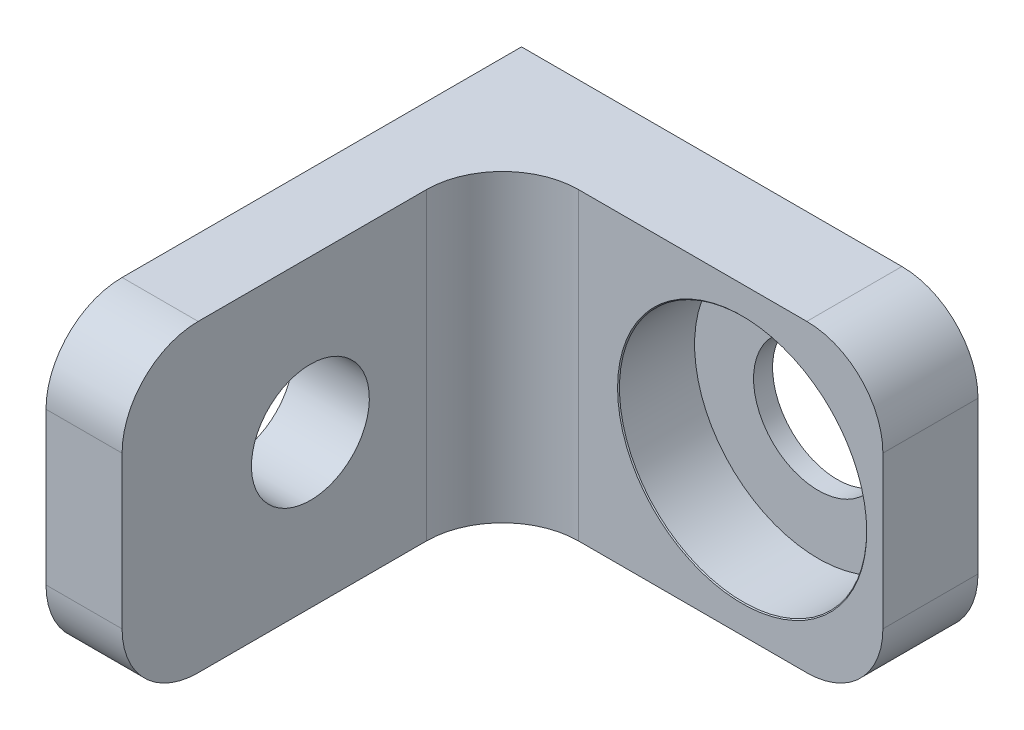
ISO-10303-21;
HEADER;
FILE_DESCRIPTION(('STEP AP214'),'2;1');
FILE_NAME('part.step','',(''),(''),'','','');
FILE_SCHEMA(('AUTOMOTIVE_DESIGN { 1 0 10303 214 1 1 1 1 }'));
ENDSEC;
DATA;
#1=APPLICATION_CONTEXT('core data for automotive mechanical design processes');
#2=APPLICATION_PROTOCOL_DEFINITION('international standard','automotive_design',2000,#1);
#3=PRODUCT_CONTEXT('',#1,'mechanical');
#4=PRODUCT('Part','Part','',(#3));
#5=PRODUCT_RELATED_PRODUCT_CATEGORY('part','',(#4));
#6=PRODUCT_DEFINITION_FORMATION('','',#4);
#7=PRODUCT_DEFINITION_CONTEXT('part definition',#1,'design');
#8=PRODUCT_DEFINITION('design','',#6,#7);
#9=PRODUCT_DEFINITION_SHAPE('','',#8);
#10=(LENGTH_UNIT() NAMED_UNIT(*) SI_UNIT(.MILLI.,.METRE.));
#11=(NAMED_UNIT(*) PLANE_ANGLE_UNIT() SI_UNIT($,.RADIAN.));
#12=(NAMED_UNIT(*) SI_UNIT($,.STERADIAN.) SOLID_ANGLE_UNIT());
#13=UNCERTAINTY_MEASURE_WITH_UNIT(LENGTH_MEASURE(1.E-05),#10,'distance_accuracy_value','');
#14=(GEOMETRIC_REPRESENTATION_CONTEXT(3) GLOBAL_UNCERTAINTY_ASSIGNED_CONTEXT((#13)) GLOBAL_UNIT_ASSIGNED_CONTEXT((#10,
#11,#12)) REPRESENTATION_CONTEXT('',''));
#15=CARTESIAN_POINT('',(0.,0.,0.));
#16=DIRECTION('',(0.,0.,1.));
#17=DIRECTION('',(1.,0.,0.));
#18=AXIS2_PLACEMENT_3D('',#15,#16,#17);
#19=CARTESIAN_POINT('',(-12.,6.,2.5));
#20=DIRECTION('',(1.,0.,0.));
#21=DIRECTION('',(0.,1.,0.));
#22=AXIS2_PLACEMENT_3D('',#19,#20,#21);
#23=PLANE('',#22);
#24=CARTESIAN_POINT('',(-12.,2.,7.55));
#25=DIRECTION('',(1.,0.,0.));
#26=DIRECTION('',(0.,1.,0.));
#27=AXIS2_PLACEMENT_3D('',#24,#25,#26);
#28=CIRCLE('',#27,1.55);
#29=CARTESIAN_POINT('',(-12.,3.55,7.55));
#30=VERTEX_POINT('',#29);
#31=EDGE_CURVE('E296',#30,#30,#28,.F.);
#32=ORIENTED_EDGE('',*,*,#31,.F.);
#33=EDGE_LOOP('',(#32));
#34=FACE_BOUND('',#33,.T.);
#35=DIRECTION('',(0.,0.,-1.));
#36=VECTOR('',#35,1.);
#37=CARTESIAN_POINT('',(-12.,-2.,2.5));
#38=LINE('',#37,#36);
#39=CARTESIAN_POINT('',(-12.,-2.,10.5));
#40=VERTEX_POINT('',#39);
#41=CARTESIAN_POINT('',(-12.,-2.,0.));
#42=VERTEX_POINT('',#41);
#43=EDGE_CURVE('E119',#40,#42,#38,.T.);
#44=ORIENTED_EDGE('',*,*,#43,.F.);
#45=CARTESIAN_POINT('',(-12.,0.,10.5));
#46=DIRECTION('',(1.,0.,0.));
#47=DIRECTION('',(0.,1.,0.));
#48=AXIS2_PLACEMENT_3D('',#45,#46,#47);
#49=CIRCLE('',#48,2.);
#50=CARTESIAN_POINT('',(-12.,0.,12.5));
#51=VERTEX_POINT('',#50);
#52=EDGE_CURVE('E11',#40,#51,#49,.F.);
#53=ORIENTED_EDGE('',*,*,#52,.T.);
#54=DIRECTION('',(0.,-1.,0.));
#55=VECTOR('',#54,1.);
#56=CARTESIAN_POINT('',(-12.,6.,12.5));
#57=LINE('',#56,#55);
#58=CARTESIAN_POINT('',(-12.,4.,12.5));
#59=VERTEX_POINT('',#58);
#60=EDGE_CURVE('E195',#59,#51,#57,.T.);
#61=ORIENTED_EDGE('',*,*,#60,.F.);
#62=CARTESIAN_POINT('',(-12.,4.,10.5));
#63=DIRECTION('',(1.,0.,0.));
#64=DIRECTION('',(0.,1.,0.));
#65=AXIS2_PLACEMENT_3D('',#62,#63,#64);
#66=CIRCLE('',#65,2.);
#67=CARTESIAN_POINT('',(-12.,6.,10.5));
#68=VERTEX_POINT('',#67);
#69=EDGE_CURVE('E42',#59,#68,#66,.F.);
#70=ORIENTED_EDGE('',*,*,#69,.T.);
#71=DIRECTION('',(0.,0.,-1.));
#72=VECTOR('',#71,1.);
#73=CARTESIAN_POINT('',(-12.,6.,2.5));
#74=LINE('',#73,#72);
#75=CARTESIAN_POINT('',(-12.,6.,0.));
#76=VERTEX_POINT('',#75);
#77=EDGE_CURVE('E130',#68,#76,#74,.T.);
#78=ORIENTED_EDGE('',*,*,#77,.T.);
#79=DIRECTION('',(0.,-1.,0.));
#80=VECTOR('',#79,1.);
#81=CARTESIAN_POINT('',(-12.,6.,0.));
#82=LINE('',#81,#80);
#83=EDGE_CURVE('E136',#76,#42,#82,.T.);
#84=ORIENTED_EDGE('',*,*,#83,.T.);
#85=EDGE_LOOP('',(#44,#53,#61,#70,#78,#84));
#86=FACE_BOUND('',#85,.T.);
#87=ADVANCED_FACE('F34',(#34,#86),#23,.F.);
#88=CARTESIAN_POINT('',(-12.,-2.,2.5));
#89=DIRECTION('',(0.,1.,0.));
#90=DIRECTION('',(0.,0.,1.));
#91=AXIS2_PLACEMENT_3D('',#88,#89,#90);
#92=PLANE('',#91);
#93=DIRECTION('',(1.,0.,0.));
#94=VECTOR('',#93,1.);
#95=CARTESIAN_POINT('',(-12.,-2.,0.));
#96=LINE('',#95,#94);
#97=CARTESIAN_POINT('',(-2.,-2.,0.));
#98=VERTEX_POINT('',#97);
#99=EDGE_CURVE('E122',#42,#98,#96,.T.);
#100=ORIENTED_EDGE('',*,*,#99,.T.);
#101=DIRECTION('',(0.,0.,-1.));
#102=VECTOR('',#101,1.);
#103=CARTESIAN_POINT('',(-2.,-2.,2.5));
#104=LINE('',#103,#102);
#105=CARTESIAN_POINT('',(-2.,-2.,2.5));
#106=VERTEX_POINT('',#105);
#107=EDGE_CURVE('E185',#98,#106,#104,.F.);
#108=ORIENTED_EDGE('',*,*,#107,.T.);
#109=DIRECTION('',(1.,0.,0.));
#110=VECTOR('',#109,1.);
#111=CARTESIAN_POINT('',(-12.,-2.,2.5));
#112=LINE('',#111,#110);
#113=CARTESIAN_POINT('',(-8.,-2.,2.5));
#114=VERTEX_POINT('',#113);
#115=EDGE_CURVE('E155',#114,#106,#112,.T.);
#116=ORIENTED_EDGE('',*,*,#115,.F.);
#117=CARTESIAN_POINT('',(-8.,-2.,4.5));
#118=DIRECTION('',(0.,1.,0.));
#119=DIRECTION('',(0.,0.,1.));
#120=AXIS2_PLACEMENT_3D('',#117,#118,#119);
#121=CIRCLE('',#120,2.);
#122=CARTESIAN_POINT('',(-10.,-2.,4.5));
#123=VERTEX_POINT('',#122);
#124=EDGE_CURVE('E164',#114,#123,#121,.T.);
#125=ORIENTED_EDGE('',*,*,#124,.T.);
#126=DIRECTION('',(0.,0.,-1.));
#127=VECTOR('',#126,1.);
#128=CARTESIAN_POINT('',(-10.,-2.,12.5));
#129=LINE('',#128,#127);
#130=CARTESIAN_POINT('',(-10.,-2.,10.5));
#131=VERTEX_POINT('',#130);
#132=EDGE_CURVE('E143',#131,#123,#129,.T.);
#133=ORIENTED_EDGE('',*,*,#132,.F.);
#134=DIRECTION('',(1.,0.,0.));
#135=VECTOR('',#134,1.);
#136=CARTESIAN_POINT('',(-12.,-2.,10.5));
#137=LINE('',#136,#135);
#138=EDGE_CURVE('E125',#131,#40,#137,.F.);
#139=ORIENTED_EDGE('',*,*,#138,.T.);
#140=ORIENTED_EDGE('',*,*,#43,.T.);
#141=EDGE_LOOP('',(#100,#108,#116,#125,#133,#139,#140));
#142=FACE_BOUND('',#141,.T.);
#143=ADVANCED_FACE('F121',(#142),#92,.F.);
#144=CARTESIAN_POINT('',(0.,6.,2.5));
#145=DIRECTION('',(-1.,0.,0.));
#146=DIRECTION('',(0.,-1.,0.));
#147=AXIS2_PLACEMENT_3D('',#144,#145,#146);
#148=PLANE('',#147);
#149=DIRECTION('',(0.,1.,0.));
#150=VECTOR('',#149,1.);
#151=CARTESIAN_POINT('',(0.,6.,0.));
#152=LINE('',#151,#150);
#153=CARTESIAN_POINT('',(0.,0.,0.));
#154=VERTEX_POINT('',#153);
#155=CARTESIAN_POINT('',(0.,4.,0.));
#156=VERTEX_POINT('',#155);
#157=EDGE_CURVE('E139',#154,#156,#152,.T.);
#158=ORIENTED_EDGE('',*,*,#157,.T.);
#159=DIRECTION('',(0.,0.,-1.));
#160=VECTOR('',#159,1.);
#161=CARTESIAN_POINT('',(0.,4.,2.5));
#162=LINE('',#161,#160);
#163=CARTESIAN_POINT('',(0.,4.,2.5));
#164=VERTEX_POINT('',#163);
#165=EDGE_CURVE('E178',#156,#164,#162,.F.);
#166=ORIENTED_EDGE('',*,*,#165,.T.);
#167=DIRECTION('',(0.,1.,0.));
#168=VECTOR('',#167,1.);
#169=CARTESIAN_POINT('',(0.,6.,2.5));
#170=LINE('',#169,#168);
#171=CARTESIAN_POINT('',(0.,0.,2.5));
#172=VERTEX_POINT('',#171);
#173=EDGE_CURVE('E212',#172,#164,#170,.T.);
#174=ORIENTED_EDGE('',*,*,#173,.F.);
#175=DIRECTION('',(0.,0.,-1.));
#176=VECTOR('',#175,1.);
#177=CARTESIAN_POINT('',(0.,0.,2.5));
#178=LINE('',#177,#176);
#179=EDGE_CURVE('E175',#172,#154,#178,.T.);
#180=ORIENTED_EDGE('',*,*,#179,.T.);
#181=EDGE_LOOP('',(#158,#166,#174,#180));
#182=FACE_BOUND('',#181,.T.);
#183=ADVANCED_FACE('F231',(#182),#148,.F.);
#184=CARTESIAN_POINT('',(-12.,6.,2.5));
#185=DIRECTION('',(0.,-1.,0.));
#186=DIRECTION('',(0.,0.,-1.));
#187=AXIS2_PLACEMENT_3D('',#184,#185,#186);
#188=PLANE('',#187);
#189=DIRECTION('',(-1.,0.,0.));
#190=VECTOR('',#189,1.);
#191=CARTESIAN_POINT('',(-12.,6.,2.5));
#192=LINE('',#191,#190);
#193=CARTESIAN_POINT('',(-2.,6.,2.5));
#194=VERTEX_POINT('',#193);
#195=CARTESIAN_POINT('',(-8.,6.,2.5));
#196=VERTEX_POINT('',#195);
#197=EDGE_CURVE('E148',#194,#196,#192,.T.);
#198=ORIENTED_EDGE('',*,*,#197,.F.);
#199=DIRECTION('',(0.,0.,-1.));
#200=VECTOR('',#199,1.);
#201=CARTESIAN_POINT('',(-2.,6.,2.5));
#202=LINE('',#201,#200);
#203=CARTESIAN_POINT('',(-2.,6.,0.));
#204=VERTEX_POINT('',#203);
#205=EDGE_CURVE('E169',#194,#204,#202,.T.);
#206=ORIENTED_EDGE('',*,*,#205,.T.);
#207=DIRECTION('',(-1.,0.,0.));
#208=VECTOR('',#207,1.);
#209=CARTESIAN_POINT('',(-12.,6.,0.));
#210=LINE('',#209,#208);
#211=EDGE_CURVE('E153',#204,#76,#210,.T.);
#212=ORIENTED_EDGE('',*,*,#211,.T.);
#213=ORIENTED_EDGE('',*,*,#77,.F.);
#214=DIRECTION('',(-1.,0.,0.));
#215=VECTOR('',#214,1.);
#216=CARTESIAN_POINT('',(-10.,6.,10.5));
#217=LINE('',#216,#215);
#218=CARTESIAN_POINT('',(-10.,6.,10.5));
#219=VERTEX_POINT('',#218);
#220=EDGE_CURVE('E167',#68,#219,#217,.F.);
#221=ORIENTED_EDGE('',*,*,#220,.T.);
#222=DIRECTION('',(0.,0.,-1.));
#223=VECTOR('',#222,1.);
#224=CARTESIAN_POINT('',(-10.,6.,12.5));
#225=LINE('',#224,#223);
#226=CARTESIAN_POINT('',(-10.,6.,4.5));
#227=VERTEX_POINT('',#226);
#228=EDGE_CURVE('E145',#219,#227,#225,.T.);
#229=ORIENTED_EDGE('',*,*,#228,.T.);
#230=CARTESIAN_POINT('',(-8.,6.,4.5));
#231=DIRECTION('',(0.,-1.,0.));
#232=DIRECTION('',(0.,0.,-1.));
#233=AXIS2_PLACEMENT_3D('',#230,#231,#232);
#234=CIRCLE('',#233,2.);
#235=EDGE_CURVE('E161',#227,#196,#234,.T.);
#236=ORIENTED_EDGE('',*,*,#235,.T.);
#237=EDGE_LOOP('',(#198,#206,#212,#213,#221,#229,#236));
#238=FACE_BOUND('',#237,.T.);
#239=ADVANCED_FACE('F201',(#238),#188,.F.);
#240=CARTESIAN_POINT('',(0.,0.,2.5));
#241=DIRECTION('',(0.,0.,1.));
#242=DIRECTION('',(1.,0.,0.));
#243=AXIS2_PLACEMENT_3D('',#240,#241,#242);
#244=PLANE('',#243);
#245=CARTESIAN_POINT('',(-3.7,2.,2.5));
#246=DIRECTION('',(0.,0.,1.));
#247=DIRECTION('',(1.,0.,0.));
#248=AXIS2_PLACEMENT_3D('',#245,#246,#247);
#249=CIRCLE('',#248,3.275);
#250=CARTESIAN_POINT('',(-0.424999999999997,2.,2.5));
#251=VERTEX_POINT('',#250);
#252=EDGE_CURVE('E297',#251,#251,#249,.T.);
#253=ORIENTED_EDGE('',*,*,#252,.F.);
#254=EDGE_LOOP('',(#253));
#255=FACE_BOUND('',#254,.T.);
#256=ORIENTED_EDGE('',*,*,#173,.T.);
#257=CARTESIAN_POINT('',(-2.,4.,2.5));
#258=DIRECTION('',(0.,0.,1.));
#259=DIRECTION('',(1.,0.,0.));
#260=AXIS2_PLACEMENT_3D('',#257,#258,#259);
#261=CIRCLE('',#260,2.);
#262=EDGE_CURVE('E182',#164,#194,#261,.T.);
#263=ORIENTED_EDGE('',*,*,#262,.T.);
#264=ORIENTED_EDGE('',*,*,#197,.T.);
#265=DIRECTION('',(0.,1.,0.));
#266=VECTOR('',#265,1.);
#267=CARTESIAN_POINT('',(-8.,0.,2.5));
#268=LINE('',#267,#266);
#269=EDGE_CURVE('E159',#196,#114,#268,.F.);
#270=ORIENTED_EDGE('',*,*,#269,.T.);
#271=ORIENTED_EDGE('',*,*,#115,.T.);
#272=CARTESIAN_POINT('',(-2.,0.,2.5));
#273=DIRECTION('',(0.,0.,1.));
#274=DIRECTION('',(1.,0.,0.));
#275=AXIS2_PLACEMENT_3D('',#272,#273,#274);
#276=CIRCLE('',#275,2.);
#277=EDGE_CURVE('E180',#106,#172,#276,.T.);
#278=ORIENTED_EDGE('',*,*,#277,.T.);
#279=EDGE_LOOP('',(#256,#263,#264,#270,#271,#278));
#280=FACE_BOUND('',#279,.T.);
#281=ADVANCED_FACE('F217',(#255,#280),#244,.T.);
#282=CARTESIAN_POINT('',(0.,0.,0.));
#283=DIRECTION('',(0.,0.,1.));
#284=DIRECTION('',(1.,0.,0.));
#285=AXIS2_PLACEMENT_3D('',#282,#283,#284);
#286=PLANE('',#285);
#287=CARTESIAN_POINT('',(-3.7,2.,0.));
#288=DIRECTION('',(0.,0.,1.));
#289=DIRECTION('',(1.,0.,0.));
#290=AXIS2_PLACEMENT_3D('',#287,#288,#289);
#291=CIRCLE('',#290,1.7);
#292=CARTESIAN_POINT('',(-2.,2.,0.));
#293=VERTEX_POINT('',#292);
#294=EDGE_CURVE('E207',#293,#293,#291,.T.);
#295=ORIENTED_EDGE('',*,*,#294,.T.);
#296=EDGE_LOOP('',(#295));
#297=FACE_BOUND('',#296,.T.);
#298=ORIENTED_EDGE('',*,*,#211,.F.);
#299=CARTESIAN_POINT('',(-2.,4.,0.));
#300=DIRECTION('',(0.,0.,1.));
#301=DIRECTION('',(1.,0.,0.));
#302=AXIS2_PLACEMENT_3D('',#299,#300,#301);
#303=CIRCLE('',#302,2.);
#304=EDGE_CURVE('E173',#204,#156,#303,.F.);
#305=ORIENTED_EDGE('',*,*,#304,.T.);
#306=ORIENTED_EDGE('',*,*,#157,.F.);
#307=CARTESIAN_POINT('',(-2.,0.,0.));
#308=DIRECTION('',(0.,0.,1.));
#309=DIRECTION('',(1.,0.,0.));
#310=AXIS2_PLACEMENT_3D('',#307,#308,#309);
#311=CIRCLE('',#310,2.);
#312=EDGE_CURVE('E138',#154,#98,#311,.F.);
#313=ORIENTED_EDGE('',*,*,#312,.T.);
#314=ORIENTED_EDGE('',*,*,#99,.F.);
#315=ORIENTED_EDGE('',*,*,#83,.F.);
#316=EDGE_LOOP('',(#298,#305,#306,#313,#314,#315));
#317=FACE_BOUND('',#316,.T.);
#318=ADVANCED_FACE('F135',(#297,#317),#286,.F.);
#319=CARTESIAN_POINT('',(-10.,6.,12.5));
#320=DIRECTION('',(-1.,0.,0.));
#321=DIRECTION('',(0.,-1.,0.));
#322=AXIS2_PLACEMENT_3D('',#319,#320,#321);
#323=PLANE('',#322);
#324=CARTESIAN_POINT('',(-10.,2.,7.55));
#325=DIRECTION('',(1.,0.,0.));
#326=DIRECTION('',(0.,1.,0.));
#327=AXIS2_PLACEMENT_3D('',#324,#325,#326);
#328=CIRCLE('',#327,1.55);
#329=CARTESIAN_POINT('',(-10.,3.55,7.55));
#330=VERTEX_POINT('',#329);
#331=EDGE_CURVE('E294',#330,#330,#328,.T.);
#332=ORIENTED_EDGE('',*,*,#331,.F.);
#333=EDGE_LOOP('',(#332));
#334=FACE_BOUND('',#333,.T.);
#335=DIRECTION('',(0.,1.,0.));
#336=VECTOR('',#335,1.);
#337=CARTESIAN_POINT('',(-10.,6.,12.5));
#338=LINE('',#337,#336);
#339=CARTESIAN_POINT('',(-10.,0.,12.5));
#340=VERTEX_POINT('',#339);
#341=CARTESIAN_POINT('',(-10.,4.,12.5));
#342=VERTEX_POINT('',#341);
#343=EDGE_CURVE('E204',#340,#342,#338,.T.);
#344=ORIENTED_EDGE('',*,*,#343,.F.);
#345=CARTESIAN_POINT('',(-10.,0.,10.5));
#346=DIRECTION('',(-1.,0.,0.));
#347=DIRECTION('',(0.,-1.,0.));
#348=AXIS2_PLACEMENT_3D('',#345,#346,#347);
#349=CIRCLE('',#348,2.);
#350=EDGE_CURVE('E57',#340,#131,#349,.F.);
#351=ORIENTED_EDGE('',*,*,#350,.T.);
#352=ORIENTED_EDGE('',*,*,#132,.T.);
#353=DIRECTION('',(0.,1.,0.));
#354=VECTOR('',#353,1.);
#355=CARTESIAN_POINT('',(-10.,6.,4.5));
#356=LINE('',#355,#354);
#357=EDGE_CURVE('E129',#123,#227,#356,.T.);
#358=ORIENTED_EDGE('',*,*,#357,.T.);
#359=ORIENTED_EDGE('',*,*,#228,.F.);
#360=CARTESIAN_POINT('',(-10.,4.,10.5));
#361=DIRECTION('',(-1.,0.,0.));
#362=DIRECTION('',(0.,-1.,0.));
#363=AXIS2_PLACEMENT_3D('',#360,#361,#362);
#364=CIRCLE('',#363,2.);
#365=EDGE_CURVE('E49',#219,#342,#364,.F.);
#366=ORIENTED_EDGE('',*,*,#365,.T.);
#367=EDGE_LOOP('',(#344,#351,#352,#358,#359,#366));
#368=FACE_BOUND('',#367,.T.);
#369=ADVANCED_FACE('F260',(#334,#368),#323,.F.);
#370=CARTESIAN_POINT('',(0.,0.,12.5));
#371=DIRECTION('',(0.,0.,1.));
#372=DIRECTION('',(1.,0.,0.));
#373=AXIS2_PLACEMENT_3D('',#370,#371,#372);
#374=PLANE('',#373);
#375=ORIENTED_EDGE('',*,*,#60,.T.);
#376=DIRECTION('',(1.,0.,0.));
#377=VECTOR('',#376,1.);
#378=CARTESIAN_POINT('',(-10.,0.,12.5));
#379=LINE('',#378,#377);
#380=EDGE_CURVE('E190',#51,#340,#379,.T.);
#381=ORIENTED_EDGE('',*,*,#380,.T.);
#382=ORIENTED_EDGE('',*,*,#343,.T.);
#383=DIRECTION('',(-1.,0.,0.));
#384=VECTOR('',#383,1.);
#385=CARTESIAN_POINT('',(-12.,4.,12.5));
#386=LINE('',#385,#384);
#387=EDGE_CURVE('E187',#342,#59,#386,.T.);
#388=ORIENTED_EDGE('',*,*,#387,.T.);
#389=EDGE_LOOP('',(#375,#381,#382,#388));
#390=FACE_BOUND('',#389,.T.);
#391=ADVANCED_FACE('F203',(#390),#374,.T.);
#392=CARTESIAN_POINT('',(-3.7,2.,2.5));
#393=DIRECTION('',(0.,0.,1.));
#394=DIRECTION('',(1.,0.,0.));
#395=AXIS2_PLACEMENT_3D('',#392,#393,#394);
#396=CYLINDRICAL_SURFACE('',#395,1.70000000000001);
#397=ORIENTED_EDGE('',*,*,#294,.F.);
#398=EDGE_LOOP('',(#397));
#399=FACE_BOUND('',#398,.T.);
#400=CARTESIAN_POINT('',(-3.7,2.,0.500000000000005));
#401=DIRECTION('',(0.,0.,1.));
#402=DIRECTION('',(1.,0.,0.));
#403=AXIS2_PLACEMENT_3D('',#400,#401,#402);
#404=CIRCLE('',#403,1.70000000000001);
#405=CARTESIAN_POINT('',(-1.99999999999998,2.,0.500000000000005));
#406=VERTEX_POINT('',#405);
#407=EDGE_CURVE('E309',#406,#406,#404,.T.);
#408=ORIENTED_EDGE('',*,*,#407,.T.);
#409=EDGE_LOOP('',(#408));
#410=FACE_BOUND('',#409,.T.);
#411=ADVANCED_FACE('F270',(#399,#410),#396,.F.);
#412=CARTESIAN_POINT('',(-0.450000000000002,2.,0.500000000000005));
#413=DIRECTION('',(0.,0.,-1.));
#414=DIRECTION('',(-1.,0.,0.));
#415=AXIS2_PLACEMENT_3D('',#412,#413,#414);
#416=PLANE('',#415);
#417=ORIENTED_EDGE('',*,*,#407,.F.);
#418=EDGE_LOOP('',(#417));
#419=FACE_BOUND('',#418,.T.);
#420=CARTESIAN_POINT('',(-3.7,2.,0.500000000000005));
#421=DIRECTION('',(0.,0.,1.));
#422=DIRECTION('',(1.,0.,0.));
#423=AXIS2_PLACEMENT_3D('',#420,#421,#422);
#424=CIRCLE('',#423,3.25);
#425=CARTESIAN_POINT('',(-0.450000000000002,2.,0.500000000000005));
#426=VERTEX_POINT('',#425);
#427=EDGE_CURVE('E306',#426,#426,#424,.T.);
#428=ORIENTED_EDGE('',*,*,#427,.T.);
#429=EDGE_LOOP('',(#428));
#430=FACE_BOUND('',#429,.T.);
#431=ADVANCED_FACE('F273',(#419,#430),#416,.F.);
#432=CARTESIAN_POINT('',(-3.7,2.,2.5));
#433=DIRECTION('',(0.,0.,1.));
#434=DIRECTION('',(1.,0.,0.));
#435=AXIS2_PLACEMENT_3D('',#432,#433,#434);
#436=CYLINDRICAL_SURFACE('',#435,3.25);
#437=ORIENTED_EDGE('',*,*,#427,.F.);
#438=EDGE_LOOP('',(#437));
#439=FACE_BOUND('',#438,.T.);
#440=CARTESIAN_POINT('',(-3.7,2.,2.47500000000001));
#441=DIRECTION('',(0.,0.,1.));
#442=DIRECTION('',(1.,0.,0.));
#443=AXIS2_PLACEMENT_3D('',#440,#441,#442);
#444=CIRCLE('',#443,3.25);
#445=CARTESIAN_POINT('',(-0.450000000000002,2.,2.47500000000001));
#446=VERTEX_POINT('',#445);
#447=EDGE_CURVE('E300',#446,#446,#444,.T.);
#448=ORIENTED_EDGE('',*,*,#447,.T.);
#449=EDGE_LOOP('',(#448));
#450=FACE_BOUND('',#449,.T.);
#451=ADVANCED_FACE('F277',(#439,#450),#436,.F.);
#452=CARTESIAN_POINT('',(-3.7,2.,2.5));
#453=DIRECTION('',(0.,0.,1.));
#454=DIRECTION('',(1.,0.,0.));
#455=AXIS2_PLACEMENT_3D('',#452,#453,#454);
#456=CONICAL_SURFACE('',#455,3.275,0.785398163397622);
#457=ORIENTED_EDGE('',*,*,#447,.F.);
#458=EDGE_LOOP('',(#457));
#459=FACE_BOUND('',#458,.T.);
#460=ORIENTED_EDGE('',*,*,#252,.T.);
#461=EDGE_LOOP('',(#460));
#462=FACE_BOUND('',#461,.T.);
#463=ADVANCED_FACE('F243',(#459,#462),#456,.F.);
#464=CARTESIAN_POINT('',(-8.,6.,4.5));
#465=DIRECTION('',(0.,1.,0.));
#466=DIRECTION('',(-1.,0.,0.));
#467=AXIS2_PLACEMENT_3D('',#464,#465,#466);
#468=CYLINDRICAL_SURFACE('',#467,2.);
#469=ORIENTED_EDGE('',*,*,#124,.F.);
#470=ORIENTED_EDGE('',*,*,#269,.F.);
#471=ORIENTED_EDGE('',*,*,#235,.F.);
#472=ORIENTED_EDGE('',*,*,#357,.F.);
#473=EDGE_LOOP('',(#469,#470,#471,#472));
#474=FACE_BOUND('',#473,.T.);
#475=ADVANCED_FACE('F225',(#474),#468,.F.);
#476=CARTESIAN_POINT('',(-2.,4.,2.5));
#477=DIRECTION('',(0.,0.,-1.));
#478=DIRECTION('',(-1.,0.,0.));
#479=AXIS2_PLACEMENT_3D('',#476,#477,#478);
#480=CYLINDRICAL_SURFACE('',#479,2.);
#481=ORIENTED_EDGE('',*,*,#262,.F.);
#482=ORIENTED_EDGE('',*,*,#165,.F.);
#483=ORIENTED_EDGE('',*,*,#304,.F.);
#484=ORIENTED_EDGE('',*,*,#205,.F.);
#485=EDGE_LOOP('',(#481,#482,#483,#484));
#486=FACE_BOUND('',#485,.T.);
#487=ADVANCED_FACE('F234',(#486),#480,.T.);
#488=CARTESIAN_POINT('',(-2.,0.,2.5));
#489=DIRECTION('',(0.,0.,-1.));
#490=DIRECTION('',(-1.,0.,0.));
#491=AXIS2_PLACEMENT_3D('',#488,#489,#490);
#492=CYLINDRICAL_SURFACE('',#491,2.);
#493=ORIENTED_EDGE('',*,*,#277,.F.);
#494=ORIENTED_EDGE('',*,*,#107,.F.);
#495=ORIENTED_EDGE('',*,*,#312,.F.);
#496=ORIENTED_EDGE('',*,*,#179,.F.);
#497=EDGE_LOOP('',(#493,#494,#495,#496));
#498=FACE_BOUND('',#497,.T.);
#499=ADVANCED_FACE('F229',(#498),#492,.T.);
#500=CARTESIAN_POINT('',(0.,0.,10.5));
#501=DIRECTION('',(-1.,0.,0.));
#502=DIRECTION('',(0.,0.,1.));
#503=AXIS2_PLACEMENT_3D('',#500,#501,#502);
#504=CYLINDRICAL_SURFACE('',#503,2.);
#505=ORIENTED_EDGE('',*,*,#52,.F.);
#506=ORIENTED_EDGE('',*,*,#138,.F.);
#507=ORIENTED_EDGE('',*,*,#350,.F.);
#508=ORIENTED_EDGE('',*,*,#380,.F.);
#509=EDGE_LOOP('',(#505,#506,#507,#508));
#510=FACE_BOUND('',#509,.T.);
#511=ADVANCED_FACE('F241',(#510),#504,.T.);
#512=CARTESIAN_POINT('',(0.,4.,10.5));
#513=DIRECTION('',(1.,0.,0.));
#514=DIRECTION('',(0.,0.,-1.));
#515=AXIS2_PLACEMENT_3D('',#512,#513,#514);
#516=CYLINDRICAL_SURFACE('',#515,2.);
#517=ORIENTED_EDGE('',*,*,#365,.F.);
#518=ORIENTED_EDGE('',*,*,#220,.F.);
#519=ORIENTED_EDGE('',*,*,#69,.F.);
#520=ORIENTED_EDGE('',*,*,#387,.F.);
#521=EDGE_LOOP('',(#517,#518,#519,#520));
#522=FACE_BOUND('',#521,.T.);
#523=ADVANCED_FACE('F36',(#522),#516,.T.);
#524=CARTESIAN_POINT('',(-12.001,2.,7.55));
#525=DIRECTION('',(1.,0.,0.));
#526=DIRECTION('',(0.,1.,0.));
#527=AXIS2_PLACEMENT_3D('',#524,#525,#526);
#528=CYLINDRICAL_SURFACE('',#527,1.55);
#529=ORIENTED_EDGE('',*,*,#331,.T.);
#530=EDGE_LOOP('',(#529));
#531=FACE_BOUND('',#530,.T.);
#532=ORIENTED_EDGE('',*,*,#31,.T.);
#533=EDGE_LOOP('',(#532));
#534=FACE_BOUND('',#533,.T.);
#535=ADVANCED_FACE('F285',(#531,#534),#528,.F.);
#536=CLOSED_SHELL('',(#87,#143,#183,#239,#281,#318,#369,#391,#411,#431,#451,#463,#475,#487,#499,
#511,#523,#535));
#537=MANIFOLD_SOLID_BREP('B2',#536);
#538=ADVANCED_BREP_SHAPE_REPRESENTATION('',(#18,#537),#14);
#539=SHAPE_DEFINITION_REPRESENTATION(#9,#538);
ENDSEC;
END-ISO-10303-21;
